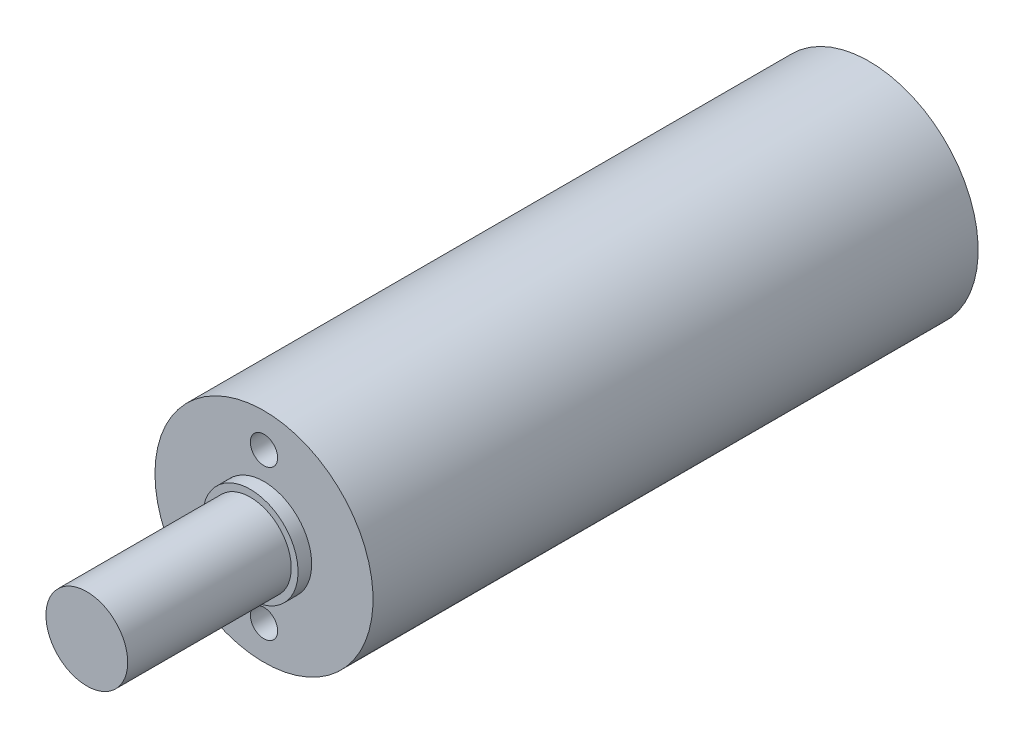
ISO-10303-21;
HEADER;
FILE_DESCRIPTION(('STEP AP214'),'2;1');
FILE_NAME('part.step','',(''),(''),'','','');
FILE_SCHEMA(('AUTOMOTIVE_DESIGN { 1 0 10303 214 1 1 1 1 }'));
ENDSEC;
DATA;
#1=APPLICATION_CONTEXT('core data for automotive mechanical design processes');
#2=APPLICATION_PROTOCOL_DEFINITION('international standard','automotive_design',2000,#1);
#3=PRODUCT_CONTEXT('',#1,'mechanical');
#4=PRODUCT('Part','Part','',(#3));
#5=PRODUCT_RELATED_PRODUCT_CATEGORY('part','',(#4));
#6=PRODUCT_DEFINITION_FORMATION('','',#4);
#7=PRODUCT_DEFINITION_CONTEXT('part definition',#1,'design');
#8=PRODUCT_DEFINITION('design','',#6,#7);
#9=PRODUCT_DEFINITION_SHAPE('','',#8);
#10=(LENGTH_UNIT() NAMED_UNIT(*) SI_UNIT(.MILLI.,.METRE.));
#11=(NAMED_UNIT(*) PLANE_ANGLE_UNIT() SI_UNIT($,.RADIAN.));
#12=(NAMED_UNIT(*) SI_UNIT($,.STERADIAN.) SOLID_ANGLE_UNIT());
#13=UNCERTAINTY_MEASURE_WITH_UNIT(LENGTH_MEASURE(1.E-05),#10,'distance_accuracy_value','');
#14=(GEOMETRIC_REPRESENTATION_CONTEXT(3) GLOBAL_UNCERTAINTY_ASSIGNED_CONTEXT((#13)) GLOBAL_UNIT_ASSIGNED_CONTEXT((#10,
#11,#12)) REPRESENTATION_CONTEXT('',''));
#15=CARTESIAN_POINT('',(0.,0.,0.));
#16=DIRECTION('',(0.,0.,1.));
#17=DIRECTION('',(1.,0.,0.));
#18=AXIS2_PLACEMENT_3D('',#15,#16,#17);
#19=CARTESIAN_POINT('',(0.,0.,12.));
#20=DIRECTION('',(0.,0.,-1.));
#21=DIRECTION('',(-1.,0.,0.));
#22=AXIS2_PLACEMENT_3D('',#19,#20,#21);
#23=CYLINDRICAL_SURFACE('',#22,3.);
#24=CARTESIAN_POINT('',(0.,0.,12.));
#25=DIRECTION('',(0.,0.,1.));
#26=DIRECTION('',(1.,0.,0.));
#27=AXIS2_PLACEMENT_3D('',#24,#25,#26);
#28=CIRCLE('',#27,3.);
#29=CARTESIAN_POINT('',(3.,0.,12.));
#30=VERTEX_POINT('',#29);
#31=EDGE_CURVE('E10',#30,#30,#28,.T.);
#32=ORIENTED_EDGE('',*,*,#31,.F.);
#33=EDGE_LOOP('',(#32));
#34=FACE_BOUND('',#33,.T.);
#35=CARTESIAN_POINT('',(0.,0.,0.));
#36=DIRECTION('',(0.,0.,1.));
#37=DIRECTION('',(1.,0.,0.));
#38=AXIS2_PLACEMENT_3D('',#35,#36,#37);
#39=CIRCLE('',#38,3.);
#40=CARTESIAN_POINT('',(3.,0.,0.));
#41=VERTEX_POINT('',#40);
#42=EDGE_CURVE('E35',#41,#41,#39,.T.);
#43=ORIENTED_EDGE('',*,*,#42,.T.);
#44=EDGE_LOOP('',(#43));
#45=FACE_BOUND('',#44,.T.);
#46=ADVANCED_FACE('F32',(#34,#45),#23,.T.);
#47=CARTESIAN_POINT('',(0.,0.,12.));
#48=DIRECTION('',(0.,0.,1.));
#49=DIRECTION('',(1.,0.,0.));
#50=AXIS2_PLACEMENT_3D('',#47,#48,#49);
#51=PLANE('',#50);
#52=ORIENTED_EDGE('',*,*,#31,.T.);
#53=EDGE_LOOP('',(#52));
#54=FACE_BOUND('',#53,.T.);
#55=ADVANCED_FACE('F105',(#54),#51,.T.);
#56=CARTESIAN_POINT('',(0.,0.,-1.));
#57=DIRECTION('',(0.,0.,1.));
#58=DIRECTION('',(1.,0.,0.));
#59=AXIS2_PLACEMENT_3D('',#56,#57,#58);
#60=CYLINDRICAL_SURFACE('',#59,3.5);
#61=CARTESIAN_POINT('',(0.,0.,-1.));
#62=DIRECTION('',(0.,0.,-1.));
#63=DIRECTION('',(-1.,0.,0.));
#64=AXIS2_PLACEMENT_3D('',#61,#62,#63);
#65=CIRCLE('',#64,3.5);
#66=CARTESIAN_POINT('',(-3.5,0.,-1.));
#67=VERTEX_POINT('',#66);
#68=EDGE_CURVE('E42',#67,#67,#65,.T.);
#69=ORIENTED_EDGE('',*,*,#68,.F.);
#70=EDGE_LOOP('',(#69));
#71=FACE_BOUND('',#70,.T.);
#72=CARTESIAN_POINT('',(0.,0.,0.));
#73=DIRECTION('',(0.,0.,-1.));
#74=DIRECTION('',(-1.,0.,0.));
#75=AXIS2_PLACEMENT_3D('',#72,#73,#74);
#76=CIRCLE('',#75,3.5);
#77=CARTESIAN_POINT('',(-3.5,0.,0.));
#78=VERTEX_POINT('',#77);
#79=EDGE_CURVE('E44',#78,#78,#76,.T.);
#80=ORIENTED_EDGE('',*,*,#79,.T.);
#81=EDGE_LOOP('',(#80));
#82=FACE_BOUND('',#81,.T.);
#83=ADVANCED_FACE('F100',(#71,#82),#60,.T.);
#84=CARTESIAN_POINT('',(0.,0.,0.));
#85=DIRECTION('',(0.,0.,-1.));
#86=DIRECTION('',(-1.,0.,0.));
#87=AXIS2_PLACEMENT_3D('',#84,#85,#86);
#88=PLANE('',#87);
#89=ORIENTED_EDGE('',*,*,#42,.F.);
#90=EDGE_LOOP('',(#89));
#91=FACE_BOUND('',#90,.T.);
#92=ORIENTED_EDGE('',*,*,#79,.F.);
#93=EDGE_LOOP('',(#92));
#94=FACE_BOUND('',#93,.T.);
#95=ADVANCED_FACE('F91',(#91,#94),#88,.F.);
#96=CARTESIAN_POINT('',(0.,0.,-45.4));
#97=DIRECTION('',(0.,0.,1.));
#98=DIRECTION('',(1.,0.,0.));
#99=AXIS2_PLACEMENT_3D('',#96,#97,#98);
#100=CYLINDRICAL_SURFACE('',#99,8.);
#101=CARTESIAN_POINT('',(0.,0.,-45.4));
#102=DIRECTION('',(0.,0.,-1.));
#103=DIRECTION('',(-1.,0.,0.));
#104=AXIS2_PLACEMENT_3D('',#101,#102,#103);
#105=CIRCLE('',#104,8.);
#106=CARTESIAN_POINT('',(-8.,0.,-45.4));
#107=VERTEX_POINT('',#106);
#108=EDGE_CURVE('E47',#107,#107,#105,.T.);
#109=ORIENTED_EDGE('',*,*,#108,.F.);
#110=EDGE_LOOP('',(#109));
#111=FACE_BOUND('',#110,.T.);
#112=CARTESIAN_POINT('',(0.,0.,-1.));
#113=DIRECTION('',(0.,0.,-1.));
#114=DIRECTION('',(-1.,0.,0.));
#115=AXIS2_PLACEMENT_3D('',#112,#113,#114);
#116=CIRCLE('',#115,8.);
#117=CARTESIAN_POINT('',(-8.,0.,-1.));
#118=VERTEX_POINT('',#117);
#119=EDGE_CURVE('E50',#118,#118,#116,.T.);
#120=ORIENTED_EDGE('',*,*,#119,.T.);
#121=EDGE_LOOP('',(#120));
#122=FACE_BOUND('',#121,.T.);
#123=ADVANCED_FACE('F89',(#111,#122),#100,.T.);
#124=CARTESIAN_POINT('',(0.,0.,-45.4));
#125=DIRECTION('',(0.,0.,-1.));
#126=DIRECTION('',(-1.,0.,0.));
#127=AXIS2_PLACEMENT_3D('',#124,#125,#126);
#128=PLANE('',#127);
#129=ORIENTED_EDGE('',*,*,#108,.T.);
#130=EDGE_LOOP('',(#129));
#131=FACE_BOUND('',#130,.T.);
#132=ADVANCED_FACE('F81',(#131),#128,.T.);
#133=CARTESIAN_POINT('',(0.,0.,-1.));
#134=DIRECTION('',(0.,0.,-1.));
#135=DIRECTION('',(-1.,0.,0.));
#136=AXIS2_PLACEMENT_3D('',#133,#134,#135);
#137=PLANE('',#136);
#138=CARTESIAN_POINT('',(0.,5.5,-1.));
#139=DIRECTION('',(0.,0.,1.));
#140=DIRECTION('',(1.,0.,0.));
#141=AXIS2_PLACEMENT_3D('',#138,#139,#140);
#142=CIRCLE('',#141,1.);
#143=CARTESIAN_POINT('',(1.,5.5,-1.));
#144=VERTEX_POINT('',#143);
#145=EDGE_CURVE('E62',#144,#144,#142,.T.);
#146=ORIENTED_EDGE('',*,*,#145,.F.);
#147=EDGE_LOOP('',(#146));
#148=FACE_BOUND('',#147,.T.);
#149=CARTESIAN_POINT('',(0.,-5.5,-1.));
#150=DIRECTION('',(0.,0.,1.));
#151=DIRECTION('',(1.,0.,0.));
#152=AXIS2_PLACEMENT_3D('',#149,#150,#151);
#153=CIRCLE('',#152,1.);
#154=CARTESIAN_POINT('',(1.,-5.5,-1.));
#155=VERTEX_POINT('',#154);
#156=EDGE_CURVE('E56',#155,#155,#153,.T.);
#157=ORIENTED_EDGE('',*,*,#156,.F.);
#158=EDGE_LOOP('',(#157));
#159=FACE_BOUND('',#158,.T.);
#160=ORIENTED_EDGE('',*,*,#68,.T.);
#161=EDGE_LOOP('',(#160));
#162=FACE_BOUND('',#161,.T.);
#163=ORIENTED_EDGE('',*,*,#119,.F.);
#164=EDGE_LOOP('',(#163));
#165=FACE_BOUND('',#164,.T.);
#166=ADVANCED_FACE('F77',(#148,#159,#162,#165),#137,.F.);
#167=CARTESIAN_POINT('',(0.,-5.5,-4.));
#168=DIRECTION('',(0.,0.,1.));
#169=DIRECTION('',(1.,0.,0.));
#170=AXIS2_PLACEMENT_3D('',#167,#168,#169);
#171=CYLINDRICAL_SURFACE('',#170,1.);
#172=CARTESIAN_POINT('',(0.,-5.5,-4.));
#173=DIRECTION('',(0.,0.,1.));
#174=DIRECTION('',(1.,0.,0.));
#175=AXIS2_PLACEMENT_3D('',#172,#173,#174);
#176=CIRCLE('',#175,1.);
#177=CARTESIAN_POINT('',(1.,-5.5,-4.));
#178=VERTEX_POINT('',#177);
#179=EDGE_CURVE('E59',#178,#178,#176,.T.);
#180=ORIENTED_EDGE('',*,*,#179,.F.);
#181=EDGE_LOOP('',(#180));
#182=FACE_BOUND('',#181,.T.);
#183=ORIENTED_EDGE('',*,*,#156,.T.);
#184=EDGE_LOOP('',(#183));
#185=FACE_BOUND('',#184,.T.);
#186=ADVANCED_FACE('F80',(#182,#185),#171,.F.);
#187=CARTESIAN_POINT('',(0.,-5.5,-4.));
#188=DIRECTION('',(0.,0.,1.));
#189=DIRECTION('',(1.,0.,0.));
#190=AXIS2_PLACEMENT_3D('',#187,#188,#189);
#191=PLANE('',#190);
#192=ORIENTED_EDGE('',*,*,#179,.T.);
#193=EDGE_LOOP('',(#192));
#194=FACE_BOUND('',#193,.T.);
#195=ADVANCED_FACE('F73',(#194),#191,.T.);
#196=CARTESIAN_POINT('',(0.,5.5,-4.));
#197=DIRECTION('',(0.,0.,1.));
#198=DIRECTION('',(1.,0.,0.));
#199=AXIS2_PLACEMENT_3D('',#196,#197,#198);
#200=CYLINDRICAL_SURFACE('',#199,1.);
#201=CARTESIAN_POINT('',(0.,5.5,-4.));
#202=DIRECTION('',(0.,0.,1.));
#203=DIRECTION('',(1.,0.,0.));
#204=AXIS2_PLACEMENT_3D('',#201,#202,#203);
#205=CIRCLE('',#204,1.);
#206=CARTESIAN_POINT('',(1.,5.5,-4.));
#207=VERTEX_POINT('',#206);
#208=EDGE_CURVE('E53',#207,#207,#205,.T.);
#209=ORIENTED_EDGE('',*,*,#208,.F.);
#210=EDGE_LOOP('',(#209));
#211=FACE_BOUND('',#210,.T.);
#212=ORIENTED_EDGE('',*,*,#145,.T.);
#213=EDGE_LOOP('',(#212));
#214=FACE_BOUND('',#213,.T.);
#215=ADVANCED_FACE('F70',(#211,#214),#200,.F.);
#216=CARTESIAN_POINT('',(0.,5.5,-4.));
#217=DIRECTION('',(0.,0.,1.));
#218=DIRECTION('',(1.,0.,0.));
#219=AXIS2_PLACEMENT_3D('',#216,#217,#218);
#220=PLANE('',#219);
#221=ORIENTED_EDGE('',*,*,#208,.T.);
#222=EDGE_LOOP('',(#221));
#223=FACE_BOUND('',#222,.T.);
#224=ADVANCED_FACE('F68',(#223),#220,.T.);
#225=CLOSED_SHELL('',(#46,#55,#83,#95,#123,#132,#166,#186,#195,#215,#224));
#226=MANIFOLD_SOLID_BREP('B2',#225);
#227=ADVANCED_BREP_SHAPE_REPRESENTATION('',(#18,#226),#14);
#228=SHAPE_DEFINITION_REPRESENTATION(#9,#227);
ENDSEC;
END-ISO-10303-21;
